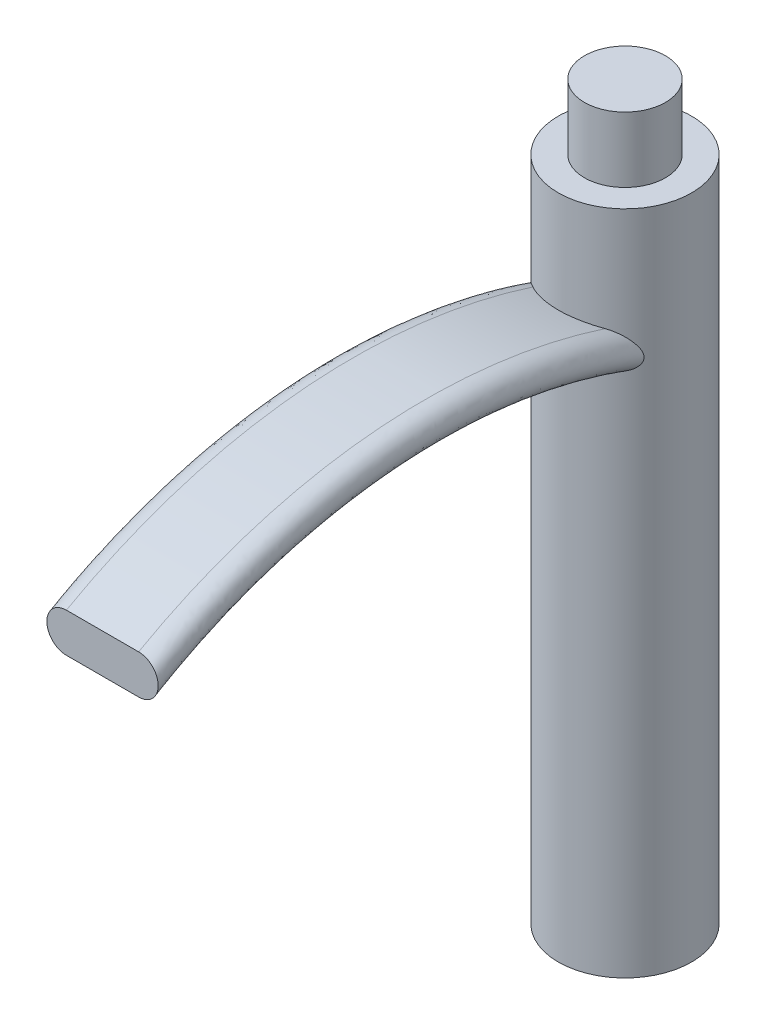
ISO-10303-21;
HEADER;
FILE_DESCRIPTION(('STEP AP214'),'2;1');
FILE_NAME('part.step','',(''),(''),'','','');
FILE_SCHEMA(('AUTOMOTIVE_DESIGN { 1 0 10303 214 1 1 1 1 }'));
ENDSEC;
DATA;
#1=APPLICATION_CONTEXT('core data for automotive mechanical design processes');
#2=APPLICATION_PROTOCOL_DEFINITION('international standard','automotive_design',2000,#1);
#3=PRODUCT_CONTEXT('',#1,'mechanical');
#4=PRODUCT('Part','Part','',(#3));
#5=PRODUCT_RELATED_PRODUCT_CATEGORY('part','',(#4));
#6=PRODUCT_DEFINITION_FORMATION('','',#4);
#7=PRODUCT_DEFINITION_CONTEXT('part definition',#1,'design');
#8=PRODUCT_DEFINITION('design','',#6,#7);
#9=PRODUCT_DEFINITION_SHAPE('','',#8);
#10=(LENGTH_UNIT() NAMED_UNIT(*) SI_UNIT(.MILLI.,.METRE.));
#11=(NAMED_UNIT(*) PLANE_ANGLE_UNIT() SI_UNIT($,.RADIAN.));
#12=(NAMED_UNIT(*) SI_UNIT($,.STERADIAN.) SOLID_ANGLE_UNIT());
#13=UNCERTAINTY_MEASURE_WITH_UNIT(LENGTH_MEASURE(1.E-05),#10,'distance_accuracy_value','');
#14=(GEOMETRIC_REPRESENTATION_CONTEXT(3) GLOBAL_UNCERTAINTY_ASSIGNED_CONTEXT((#13)) GLOBAL_UNIT_ASSIGNED_CONTEXT((#10,
#11,#12)) REPRESENTATION_CONTEXT('',''));
#15=CARTESIAN_POINT('',(0.,0.,0.));
#16=DIRECTION('',(0.,0.,1.));
#17=DIRECTION('',(1.,0.,0.));
#18=AXIS2_PLACEMENT_3D('',#15,#16,#17);
#19=CARTESIAN_POINT('',(0.,255.,0.));
#20=DIRECTION('',(0.,-1.,0.));
#21=DIRECTION('',(0.,0.,-1.));
#22=AXIS2_PLACEMENT_3D('',#19,#20,#21);
#23=CYLINDRICAL_SURFACE('',#22,25.5);
#24=CARTESIAN_POINT('',(0.,0.,0.));
#25=DIRECTION('',(0.,1.,0.));
#26=DIRECTION('',(0.,0.,1.));
#27=AXIS2_PLACEMENT_3D('',#24,#25,#26);
#28=CIRCLE('',#27,25.5);
#29=CARTESIAN_POINT('',(0.,0.,25.5));
#30=VERTEX_POINT('',#29);
#31=EDGE_CURVE('E115',#30,#30,#28,.T.);
#32=ORIENTED_EDGE('',*,*,#31,.T.);
#33=EDGE_LOOP('',(#32));
#34=FACE_BOUND('',#33,.T.);
#35=CARTESIAN_POINT('',(0.,255.,0.));
#36=DIRECTION('',(0.,1.,0.));
#37=DIRECTION('',(0.,0.,1.));
#38=AXIS2_PLACEMENT_3D('',#35,#36,#37);
#39=CIRCLE('',#38,25.5);
#40=CARTESIAN_POINT('',(0.,255.,25.5));
#41=VERTEX_POINT('',#40);
#42=EDGE_CURVE('E117',#41,#41,#39,.T.);
#43=ORIENTED_EDGE('',*,*,#42,.F.);
#44=EDGE_LOOP('',(#43));
#45=FACE_BOUND('',#44,.T.);
#46=CARTESIAN_POINT('',(13.8196887255631,214.884986685207,21.4304970434319));
#47=CARTESIAN_POINT('',(13.532798146598,214.945234375697,21.6155029437014));
#48=CARTESIAN_POINT('',(13.2419117728934,215.00339643538,21.7949250517388));
#49=CARTESIAN_POINT('',(12.6525624940685,215.115533242038,22.1422596832614));
#50=CARTESIAN_POINT('',(12.3540996431966,215.169508018984,22.3101722891239));
#51=CARTESIAN_POINT('',(11.4480530567104,215.325113080991,22.7960882597297));
#52=CARTESIAN_POINT('',(10.829725219313,215.420442128899,23.0963253235133));
#53=CARTESIAN_POINT('',(9.56895047867999,215.594067227174,23.646524715826));
#54=CARTESIAN_POINT('',(8.92650932711036,215.672367309504,23.896498944075));
#55=CARTESIAN_POINT('',(7.94820023785555,215.776975355202,24.2321082823706));
#56=CARTESIAN_POINT('',(7.61964826874133,215.809704961552,24.33742136081));
#57=CARTESIAN_POINT('',(6.95808921534775,215.870892028333,24.5347544640246));
#58=CARTESIAN_POINT('',(6.62508098736632,215.899348368202,24.6267710018604));
#59=CARTESIAN_POINT('',(5.61985324656249,215.978321264444,24.8826335475942));
#60=CARTESIAN_POINT('',(4.94183131288253,216.022398981806,25.0261549688713));
#61=CARTESIAN_POINT('',(3.57547465021561,216.093321797557,25.2575948826567));
#62=CARTESIAN_POINT('',(2.88713999184847,216.120167013896,25.345513755744));
#63=CARTESIAN_POINT('',(1.85085964276173,216.147499566447,25.4351062656168));
#64=CARTESIAN_POINT('',(1.50479458937133,216.154454550589,25.4579228433247));
#65=CARTESIAN_POINT('',(0.812053976632948,216.164054314837,25.4894246119201));
#66=CARTESIAN_POINT('',(0.465378597778197,216.166700206226,25.4981134462423));
#67=CARTESIAN_POINT('',(-0.574795102878685,216.168173129265,25.5029449402628));
#68=CARTESIAN_POINT('',(-1.26853278332441,216.160537823633,25.4778605192752));
#69=CARTESIAN_POINT('',(-2.64448121939722,216.12819106405,25.3718038099115));
#70=CARTESIAN_POINT('',(-3.32673860923,216.103645087736,25.291373115772));
#71=CARTESIAN_POINT('',(-4.68182856987711,216.037663617282,25.0759064586185));
#72=CARTESIAN_POINT('',(-5.35466044163665,215.996226877206,24.9408664673929));
#73=CARTESIAN_POINT('',(-6.68583695255088,215.896514926497,24.6174468865112));
#74=CARTESIAN_POINT('',(-7.34418624726443,215.838245214683,24.4290847159912));
#75=CARTESIAN_POINT('',(-8.64196304630876,215.704924169955,24.0006895031074));
#76=CARTESIAN_POINT('',(-9.28139629297756,215.629877990312,23.760672328582));
#77=CARTESIAN_POINT('',(-10.2507928710369,215.501129816785,23.3518497319931));
#78=CARTESIAN_POINT('',(-10.5889925548715,215.453286033916,23.2004371833328));
#79=CARTESIAN_POINT('',(-11.2579146358696,215.352673220706,22.8833196752015));
#80=CARTESIAN_POINT('',(-11.5886368164765,215.299904047947,22.7176143024624));
#81=CARTESIAN_POINT('',(-12.2412096635843,215.189589784856,22.3727218839855));
#82=CARTESIAN_POINT('',(-12.563078073561,215.132055340164,22.1935649685777));
#83=CARTESIAN_POINT('',(-13.1980800580386,215.012144836201,21.8219178949788));
#84=CARTESIAN_POINT('',(-13.5112139827944,214.949768971454,21.6294282725137));
#85=CARTESIAN_POINT('',(-13.8196887255631,214.884986685207,21.4304970434319));
#86=B_SPLINE_CURVE_WITH_KNOTS('',3,(#46,#47,#48,#49,#50,#51,#52,#53,#54,#55,#56,#57,#58,#59,#60,
#61,#62,#63,#64,#65,#66,#67,#68,#69,#70,#71,#72,#73,#74,#75,#76,#77,#78,#79,#80,#81,#82,#83,#84,
#85),.UNSPECIFIED.,.F.,.F.,(4,2,2,2,2,2,2,2,2,2,2,2,2,2,2,2,2,2,2,4),(0.,1.03979015362932,
2.07957286435021,4.15882724270732,6.2375887767455,7.27701727949552,8.31671787347411,
10.3973920597929,12.4780520045083,13.5184330677545,14.5585457822746,16.6384956144035,
18.6983761299918,20.758408618764,22.8177689171165,24.8764975037429,25.997042474922,
27.1176198568306,28.2357581050497,29.3538514510127),.UNSPECIFIED.);
#87=CARTESIAN_POINT('',(13.8196887255631,214.884986685207,21.4304970434319));
#88=VERTEX_POINT('',#87);
#89=CARTESIAN_POINT('',(-13.8196887255631,214.884986685207,21.4304970434319));
#90=VERTEX_POINT('',#89);
#91=EDGE_CURVE('E41',#88,#90,#86,.T.);
#92=ORIENTED_EDGE('',*,*,#91,.F.);
#93=CARTESIAN_POINT('',(13.8196887255631,201.258699076624,21.4304970434319));
#94=CARTESIAN_POINT('',(14.0221240799943,201.213283085582,21.2999703202598));
#95=CARTESIAN_POINT('',(14.223639095181,201.173891435771,21.1659450607403));
#96=CARTESIAN_POINT('',(14.6241745694017,201.106944234392,20.891202329935));
#97=CARTESIAN_POINT('',(14.8231940414344,201.079393230905,20.7504823101521));
#98=CARTESIAN_POINT('',(15.2179730865984,201.035944334901,20.4627228262207));
#99=CARTESIAN_POINT('',(15.4137319055702,201.020049102664,20.3156819275149));
#100=CARTESIAN_POINT('',(15.8031928976953,200.999747428518,20.0142525038005));
#101=CARTESIAN_POINT('',(15.9968563579354,200.995454616357,19.8598062784095));
#102=CARTESIAN_POINT('',(16.3795062967343,200.998730471166,19.5454109047559));
#103=CARTESIAN_POINT('',(16.5684935410221,201.006297182909,19.3854626678371));
#104=CARTESIAN_POINT('',(16.9411947859911,201.033498213782,19.0606137020647));
#105=CARTESIAN_POINT('',(17.124910300471,201.053129031612,18.895714423327));
#106=CARTESIAN_POINT('',(17.4379661363085,201.097932296693,18.6064445683791));
#107=CARTESIAN_POINT('',(17.5686606858122,201.120201206568,18.4830811303908));
#108=CARTESIAN_POINT('',(17.8267021382103,201.171682587077,18.234330142158));
#109=CARTESIAN_POINT('',(17.9540493447005,201.200894425574,18.1089427771553));
#110=CARTESIAN_POINT('',(18.2051822606488,201.266623158692,17.8564568412648));
#111=CARTESIAN_POINT('',(18.3289670901309,201.303141840825,17.729357858765));
#112=CARTESIAN_POINT('',(18.5722371433926,201.383813196673,17.4743511293789));
#113=CARTESIAN_POINT('',(18.6917358009064,201.427938930212,17.346447721544));
#114=CARTESIAN_POINT('',(18.9265291684782,201.524515830127,17.089959476287));
#115=CARTESIAN_POINT('',(19.041824657133,201.576965444848,16.9613747701754));
#116=CARTESIAN_POINT('',(19.2677710673765,201.690961139295,16.7042586777333));
#117=CARTESIAN_POINT('',(19.3784244918119,201.752502234114,16.575727300648));
#118=CARTESIAN_POINT('',(19.5716280480186,201.871549976837,16.3468283590451));
#119=CARTESIAN_POINT('',(19.6551516088303,201.927132844775,16.2462825337401));
#120=CARTESIAN_POINT('',(19.8186815574607,202.045178504284,16.0463868381469));
#121=CARTESIAN_POINT('',(19.8986884930179,202.107640219077,15.9470367833722));
#122=CARTESIAN_POINT('',(20.0547582441029,202.240152434094,15.7503147437327));
#123=CARTESIAN_POINT('',(20.130821931998,202.310201245135,15.6529423242786));
#124=CARTESIAN_POINT('',(20.2784238596274,202.458644782886,15.4612482410467));
#125=CARTESIAN_POINT('',(20.3499630436132,202.537037758969,15.3669259427385));
#126=CARTESIAN_POINT('',(20.526437041792,202.749579246138,15.1310065506297));
#127=CARTESIAN_POINT('',(20.6277056016291,202.890412623693,14.992431516466));
#128=CARTESIAN_POINT('',(20.7671271304323,203.120309505911,14.798070199788));
#129=CARTESIAN_POINT('',(20.8115031078479,203.200008428171,14.7355591009882));
#130=CARTESIAN_POINT('',(20.8955691433025,203.365825830209,14.6161039567273));
#131=CARTESIAN_POINT('',(20.9352605311075,203.451942476876,14.5591583322455));
#132=CARTESIAN_POINT('',(21.0016065863349,203.611824411553,14.463235693427));
#133=CARTESIAN_POINT('',(21.0292535176124,203.684418471265,14.4229884660175));
#134=CARTESIAN_POINT('',(21.0809341036313,203.83331873223,14.3473451870523));
#135=CARTESIAN_POINT('',(21.1049686155782,203.909624047119,14.3119479847914));
#136=CARTESIAN_POINT('',(21.149163285618,204.065535165599,14.2465592813946));
#137=CARTESIAN_POINT('',(21.1693262722203,204.145138507583,14.2165638347766));
#138=CARTESIAN_POINT('',(21.2056242770619,204.307189907277,14.1623643681338));
#139=CARTESIAN_POINT('',(21.2217592293226,204.38963801156,14.1381604429737));
#140=CARTESIAN_POINT('',(21.2499293266706,204.55680471041,14.095784927884));
#141=CARTESIAN_POINT('',(21.2619621308201,204.641524571738,14.0776167824917));
#142=CARTESIAN_POINT('',(21.2819436589884,204.812514155357,14.0473913090252));
#143=CARTESIAN_POINT('',(21.2898924261647,204.89878386126,14.0353339163767));
#144=CARTESIAN_POINT('',(21.3018386384569,205.072269137142,14.0171961819804));
#145=CARTESIAN_POINT('',(21.3058335136244,205.159485285112,14.0111197277337));
#146=CARTESIAN_POINT('',(21.3100722685453,205.334246975065,14.0046717900043));
#147=CARTESIAN_POINT('',(21.3103142435183,205.421792661759,14.0043032035437));
#148=CARTESIAN_POINT('',(21.3067374668789,205.629220846205,14.0097452211609));
#149=CARTESIAN_POINT('',(21.3013746917963,205.749018119707,14.0179054110233));
#150=CARTESIAN_POINT('',(21.2847839085726,205.987279085519,14.0430834464481));
#151=CARTESIAN_POINT('',(21.2735527418765,206.105742024537,14.0601060620319));
#152=CARTESIAN_POINT('',(21.2459039757601,206.340917322379,14.1018505536985));
#153=CARTESIAN_POINT('',(21.2294757680617,206.457625584539,14.1265881762952));
#154=CARTESIAN_POINT('',(21.1920763288265,206.688666129503,14.1826314825674));
#155=CARTESIAN_POINT('',(21.1711055561593,206.802998651016,14.2139365028236));
#156=CARTESIAN_POINT('',(21.1080687218431,207.113297528452,14.3075000264974));
#157=CARTESIAN_POINT('',(21.061914641777,207.306722804999,14.3754613224528));
#158=CARTESIAN_POINT('',(20.9596202389657,207.685859438576,14.5242031440754));
#159=CARTESIAN_POINT('',(20.9034721295338,207.871564640454,14.60499366009));
#160=CARTESIAN_POINT('',(20.7825778536763,208.235850853507,14.7765181601306));
#161=CARTESIAN_POINT('',(20.7178154502505,208.414417561743,14.867270863911));
#162=CARTESIAN_POINT('',(20.5807835398563,208.764509581776,15.0563940435648));
#163=CARTESIAN_POINT('',(20.5085120499837,208.936033016906,15.1547665298196));
#164=CARTESIAN_POINT('',(20.338209865005,209.314543770224,15.3828545996837));
#165=CARTESIAN_POINT('',(20.2382610901216,209.519653840707,15.5142495088326));
#166=CARTESIAN_POINT('',(20.0285453725472,209.920171102622,15.784061904798));
#167=CARTESIAN_POINT('',(19.9187720236752,210.115571831976,15.9224839478743));
#168=CARTESIAN_POINT('',(19.6899401945214,210.496991554952,16.2046061230043));
#169=CARTESIAN_POINT('',(19.5708788553491,210.683007630687,16.3483078729209));
#170=CARTESIAN_POINT('',(19.3235050598475,211.046206221951,16.6399764127183));
#171=CARTESIAN_POINT('',(19.1951713046843,211.223366709635,16.7879525210934));
#172=CARTESIAN_POINT('',(18.9296966529644,211.568311365357,17.0867348312203));
#173=CARTESIAN_POINT('',(18.7925590173014,211.736098962472,17.2375399706374));
#174=CARTESIAN_POINT('',(18.5095028918267,212.062152081856,17.5411342037132));
#175=CARTESIAN_POINT('',(18.3635849590846,212.220418206946,17.6939231710257));
#176=CARTESIAN_POINT('',(17.9756230680295,212.61616715289,18.0898367971506));
#177=CARTESIAN_POINT('',(17.7269551659346,212.846294502257,18.3339076272844));
#178=CARTESIAN_POINT('',(17.2073131655528,213.279715144141,18.8224766987254));
#179=CARTESIAN_POINT('',(16.9363301764795,213.482997656322,19.0669750720308));
#180=CARTESIAN_POINT('',(16.3735569689031,213.858154454239,19.5523390385582));
#181=CARTESIAN_POINT('',(16.0818889183939,214.030194760562,19.7932171972977));
#182=CARTESIAN_POINT('',(15.4769504897688,214.339488660163,20.26972897253));
#183=CARTESIAN_POINT('',(15.1637053439154,214.476782036589,20.5053683024969));
#184=CARTESIAN_POINT('',(14.6753761177563,214.653456771092,20.8548436082835));
#185=CARTESIAN_POINT('',(14.5078391594198,214.707843088031,20.971763027553));
#186=CARTESIAN_POINT('',(14.1675622854689,214.805219709158,21.2031270388132));
#187=CARTESIAN_POINT('',(13.9948172160936,214.848198282992,21.3175689730837));
#188=CARTESIAN_POINT('',(13.8196887255631,214.884986685207,21.430497043432));
#189=B_SPLINE_CURVE_WITH_KNOTS('',3,(#93,#94,#95,#96,#97,#98,#99,#100,#101,#102,#103,#104,#105,
#106,#107,#108,#109,#110,#111,#112,#113,#114,#115,#116,#117,#118,#119,#120,#121,#122,#123,#124,
#125,#126,#127,#128,#129,#130,#131,#132,#133,#134,#135,#136,#137,#138,#139,#140,#141,#142,#143,
#144,#145,#146,#147,#148,#149,#150,#151,#152,#153,#154,#155,#156,#157,#158,#159,#160,#161,#162,
#163,#164,#165,#166,#167,#168,#169,#170,#171,#172,#173,#174,#175,#176,#177,#178,#179,#180,#181,
#182,#183,#184,#185,#186,#187,#188),.UNSPECIFIED.,.F.,.F.,(4,2,2,2,2,2,2,2,2,2,2,2,2,2,2,2,2,2,
2,2,2,2,2,2,2,2,2,2,2,2,2,2,2,2,2,2,2,2,2,2,2,2,2,2,2,2,2,4),(0.,0.735216444351275,
1.47071503894104,2.20638144939533,2.94922702961238,3.69195015308185,4.43445782184243,
4.97758463661088,5.52066201994618,6.06387242204665,6.6051971603739,7.14642110860481,
7.68734939470969,8.11327822851045,8.53914048416909,8.96490812043674,9.3905866049576,
10.0540344383703,10.3854518640379,10.7167749862367,10.9789778463946,11.2411183888111,
11.5030666783198,11.7650192582285,12.027121075134,12.289220122264,12.5514894167253,
12.8138918213247,13.1739046852672,13.5341115194849,13.8950584097427,14.2559688557441,
14.8853537847605,15.515231252701,16.1463132551115,16.7775623312493,17.5669119300498,
18.3567800327394,19.1468922274835,19.9388808487146,20.7305777969277,21.5222245684433,
22.7734844227782,24.0252452392116,25.2701460563236,26.5136150220386,27.1475199842769,
27.7820742749393),.UNSPECIFIED.);
#190=CARTESIAN_POINT('',(13.8196887255631,201.258699076624,21.4304970434319));
#191=VERTEX_POINT('',#190);
#192=EDGE_CURVE('E105',#191,#88,#189,.T.);
#193=ORIENTED_EDGE('',*,*,#192,.F.);
#194=CARTESIAN_POINT('',(-13.8196887255631,201.258699076624,21.4304970434319));
#195=CARTESIAN_POINT('',(-13.5346906896665,201.322663367843,21.6142825946831));
#196=CARTESIAN_POINT('',(-13.2457067773122,201.384433576239,21.7925850563932));
#197=CARTESIAN_POINT('',(-12.6601727569227,201.503565881534,22.1378759650624));
#198=CARTESIAN_POINT('',(-12.3636226867645,201.560928000493,22.3048644686448));
#199=CARTESIAN_POINT('',(-11.4633082160255,201.726358350894,22.7882964860672));
#200=CARTESIAN_POINT('',(-10.8488024321114,201.827787846608,23.0872562866366));
#201=CARTESIAN_POINT('',(-9.59555841732733,202.012685718876,23.6356300697564));
#202=CARTESIAN_POINT('',(-8.95682380893578,202.096156768064,23.8850514243524));
#203=CARTESIAN_POINT('',(-7.98399535676274,202.207797575259,24.2203130212709));
#204=CARTESIAN_POINT('',(-7.65725787720661,202.242750798803,24.3255902553234));
#205=CARTESIAN_POINT('',(-6.99929733072024,202.308142577886,24.523006341156));
#206=CARTESIAN_POINT('',(-6.66807310861819,202.338579945686,24.6151417361856));
#207=CARTESIAN_POINT('',(-5.66809648959823,202.423134654366,24.8715974684266));
#208=CARTESIAN_POINT('',(-4.99348881568168,202.470443253266,25.015812617819));
#209=CARTESIAN_POINT('',(-3.63379900626822,202.546826341604,25.2491841974334));
#210=CARTESIAN_POINT('',(-2.94871695383099,202.575900975557,25.3383410640244));
#211=CARTESIAN_POINT('',(-1.91720437180168,202.605819712573,25.4301706885657));
#212=CARTESIAN_POINT('',(-1.57272004983487,202.613510419044,25.4537962729543));
#213=CARTESIAN_POINT('',(-0.883096190055104,202.624329346345,25.4870416333762));
#214=CARTESIAN_POINT('',(-0.537956844338869,202.627458744444,25.4966650233641));
#215=CARTESIAN_POINT('',(0.497676353803143,202.630003496925,25.5044845736528));
#216=CARTESIAN_POINT('',(1.18847749292039,202.622578073623,25.4816383084945));
#217=CARTESIAN_POINT('',(2.55782867903458,202.589668146822,25.3805799237253));
#218=CARTESIAN_POINT('',(3.2364298697395,202.56438338519,25.3029801861884));
#219=CARTESIAN_POINT('',(4.58442496389245,202.495990996439,25.0937878615659));
#220=CARTESIAN_POINT('',(5.2538182278141,202.45288213776,24.9621915435814));
#221=CARTESIAN_POINT('',(6.5784240563115,202.348899635379,24.6462557462592));
#222=CARTESIAN_POINT('',(7.23364003427314,202.288030320056,24.4619291179715));
#223=CARTESIAN_POINT('',(8.52543626354619,202.148600238021,24.0422100288537));
#224=CARTESIAN_POINT('',(9.16202189068152,202.070044632749,23.806832467091));
#225=CARTESIAN_POINT('',(10.1399302415448,201.933422310255,23.4003841799243));
#226=CARTESIAN_POINT('',(10.489113542724,201.881329972768,23.2459449409988));
#227=CARTESIAN_POINT('',(11.1795221440573,201.771567891416,22.92190347616));
#228=CARTESIAN_POINT('',(11.520747110735,201.713897914352,22.752300616283));
#229=CARTESIAN_POINT('',(12.1937454818667,201.593151353711,22.3988105750644));
#230=CARTESIAN_POINT('',(12.5255380213173,201.53008693887,22.2149556270416));
#231=CARTESIAN_POINT('',(13.1797792007235,201.398486851485,21.8331620002009));
#232=CARTESIAN_POINT('',(13.5022283620515,201.329951485031,21.6352241093674));
#233=CARTESIAN_POINT('',(13.8196887255631,201.258699076624,21.4304970434319));
#234=B_SPLINE_CURVE_WITH_KNOTS('',3,(#194,#195,#196,#197,#198,#199,#200,#201,#202,#203,#204,
#205,#206,#207,#208,#209,#210,#211,#212,#213,#214,#215,#216,#217,#218,#219,#220,#221,#222,#223,
#224,#225,#226,#227,#228,#229,#230,#231,#232,#233),.UNSPECIFIED.,.F.,.F.,(4,2,2,2,2,2,2,2,2,2,2,
2,2,2,2,2,2,2,2,4),(0.,1.03514818124239,2.07029118146819,4.14029785445722,6.20999624897043,
7.24488822764033,8.2800519180795,10.3518067286705,12.4235451191819,13.4594056076452,
14.4949986939287,16.5659081962837,18.6140157028599,20.6622647474555,22.7100150322561,
24.7571684893033,25.9128543234921,27.0685884974435,28.2217810609113,29.374909150342),.UNSPECIFIED.);
#235=CARTESIAN_POINT('',(-13.8196887255631,201.258699076624,21.4304970434319));
#236=VERTEX_POINT('',#235);
#237=EDGE_CURVE('E63',#236,#191,#234,.T.);
#238=ORIENTED_EDGE('',*,*,#237,.F.);
#239=CARTESIAN_POINT('',(-13.8196887255631,214.884986685207,21.4304970434319));
#240=CARTESIAN_POINT('',(-13.9964004171649,214.847867226434,21.3165516551254));
#241=CARTESIAN_POINT('',(-14.170710256153,214.804436309184,21.2010429233251));
#242=CARTESIAN_POINT('',(-14.5138899310028,214.705990945361,20.9675913041961));
#243=CARTESIAN_POINT('',(-14.6827688829359,214.650997218909,20.8496531068762));
#244=CARTESIAN_POINT('',(-15.0150004076458,214.530356115841,20.6116842948418));
#245=CARTESIAN_POINT('',(-15.1783556155489,214.464713908313,20.491654720452));
#246=CARTESIAN_POINT('',(-15.498754950375,214.323890950157,20.2503983464359));
#247=CARTESIAN_POINT('',(-15.6558229801669,214.248751988375,20.1291788171939));
#248=CARTESIAN_POINT('',(-15.9643353425821,214.089420196198,19.8853883759523));
#249=CARTESIAN_POINT('',(-16.1157770938909,214.005223277408,19.7628168763184));
#250=CARTESIAN_POINT('',(-16.4129380137241,213.828433538845,19.5167286079683));
#251=CARTESIAN_POINT('',(-16.558655772166,213.73583866863,19.3932116151774));
#252=CARTESIAN_POINT('',(-16.8936699685306,213.509489680262,19.1028422095727));
#253=CARTESIAN_POINT('',(-17.0806325465406,213.372566487801,18.9357586682619));
#254=CARTESIAN_POINT('',(-17.4441459869844,213.085710753979,18.6014184660721));
#255=CARTESIAN_POINT('',(-17.6206955062865,212.935776540525,18.4341617856795));
#256=CARTESIAN_POINT('',(-17.9634712612026,212.623761278284,18.1003024291463));
#257=CARTESIAN_POINT('',(-18.1296951087455,212.461677438576,17.933699912582));
#258=CARTESIAN_POINT('',(-18.4522547148855,212.12560108751,17.6016479464119));
#259=CARTESIAN_POINT('',(-18.6085630850809,211.951578138287,17.4362027257387));
#260=CARTESIAN_POINT('',(-18.9107777009569,211.592468577964,17.1079583870451));
#261=CARTESIAN_POINT('',(-19.0566863760704,211.407384569491,16.9451586579272));
#262=CARTESIAN_POINT('',(-19.3379971883418,211.026360742862,16.6234021394357));
#263=CARTESIAN_POINT('',(-19.4734033012198,210.830425081193,16.4644439117131));
#264=CARTESIAN_POINT('',(-19.7197682039259,210.448842479945,16.1682968273743));
#265=CARTESIAN_POINT('',(-19.8317984828558,210.264295391447,16.0305822537862));
#266=CARTESIAN_POINT('',(-20.0469423556346,209.88616683305,15.7607063196473));
#267=CARTESIAN_POINT('',(-20.1500569002475,209.692586329861,15.6285443677458));
#268=CARTESIAN_POINT('',(-20.3465777611294,209.296373775001,15.3718198436777));
#269=CARTESIAN_POINT('',(-20.440004728659,209.093762351485,15.2472413501206));
#270=CARTESIAN_POINT('',(-20.6164425440212,208.678516990106,15.0078100856533));
#271=CARTESIAN_POINT('',(-20.6994576880923,208.465887236269,14.8929533096668));
#272=CARTESIAN_POINT('',(-20.822629073984,208.117326388632,14.7198667823143));
#273=CARTESIAN_POINT('',(-20.8666191205385,207.984844830823,14.6574042094689));
#274=CARTESIAN_POINT('',(-20.9498245179231,207.715873017037,14.5382297353888));
#275=CARTESIAN_POINT('',(-20.9890410477055,207.579383761252,14.4815164147976));
#276=CARTESIAN_POINT('',(-21.0620660495322,207.302313540845,14.3751014031965));
#277=CARTESIAN_POINT('',(-21.0958768477779,207.161734367151,14.3253966973236));
#278=CARTESIAN_POINT('',(-21.1572621187927,206.876561617007,14.2345796240256));
#279=CARTESIAN_POINT('',(-21.1848388509475,206.731969516344,14.1934641440558));
#280=CARTESIAN_POINT('',(-21.242314786915,206.380144723302,14.1073655791091));
#281=CARTESIAN_POINT('',(-21.2687318686672,206.170987396731,14.0674122137805));
#282=CARTESIAN_POINT('',(-21.2948347474533,205.853812517247,14.0278380875112));
#283=CARTESIAN_POINT('',(-21.3012820608989,205.747566215751,14.0180391931628));
#284=CARTESIAN_POINT('',(-21.3091681068565,205.53443593584,14.0060493111222));
#285=CARTESIAN_POINT('',(-21.3106080034297,205.427552111415,14.003856555251));
#286=CARTESIAN_POINT('',(-21.308231120107,205.233498180645,14.0074724782623));
#287=CARTESIAN_POINT('',(-21.305325660472,205.146289952396,14.0118940276855));
#288=CARTESIAN_POINT('',(-21.2956207417531,204.97259718424,14.0266395580875));
#289=CARTESIAN_POINT('',(-21.2888221539253,204.886112486804,14.0369622184365));
#290=CARTESIAN_POINT('',(-21.2711834166175,204.714552153879,14.0636770240484));
#291=CARTESIAN_POINT('',(-21.2603457553774,204.629475684492,14.0800654325117));
#292=CARTESIAN_POINT('',(-21.2345699822987,204.461348156186,14.1189085993176));
#293=CARTESIAN_POINT('',(-21.2196318048462,204.378297129699,14.1413634547316));
#294=CARTESIAN_POINT('',(-21.185698839092,204.214840184548,14.192149087439));
#295=CARTESIAN_POINT('',(-21.1667029751652,204.134434973779,14.2204814226968));
#296=CARTESIAN_POINT('',(-21.1248074462791,203.976839282807,14.2826437791631));
#297=CARTESIAN_POINT('',(-21.1019078185178,203.899648771981,14.3164737479862));
#298=CARTESIAN_POINT('',(-21.0524181564429,203.748838841628,14.3891494222926));
#299=CARTESIAN_POINT('',(-21.0258256961771,203.675221812906,14.4279984237776));
#300=CARTESIAN_POINT('',(-20.9692323350079,203.531836939885,14.5101269640377));
#301=CARTESIAN_POINT('',(-20.9392297192277,203.462071058657,14.5534087308408));
#302=CARTESIAN_POINT('',(-20.8643360304268,203.30121674716,14.6606684858726));
#303=CARTESIAN_POINT('',(-20.8180688536346,203.211893987419,14.7263396875215));
#304=CARTESIAN_POINT('',(-20.7204414095028,203.040708910005,14.8633910501306));
#305=CARTESIAN_POINT('',(-20.6690784775654,202.958850538892,14.9347741940818));
#306=CARTESIAN_POINT('',(-20.5618511252582,202.80213518087,15.0820618167962));
#307=CARTESIAN_POINT('',(-20.5059779630991,202.727292429109,15.1579749977385));
#308=CARTESIAN_POINT('',(-20.3904091639275,202.584339287746,15.3130853703151));
#309=CARTESIAN_POINT('',(-20.330713987811,202.516228088897,15.3922821655745));
#310=CARTESIAN_POINT('',(-20.1666090787992,202.342396968619,15.6072565658397));
#311=CARTESIAN_POINT('',(-20.0591585469417,202.242237791775,15.7452222892664));
#312=CARTESIAN_POINT('',(-19.8364473591398,202.056941694023,16.024899358167));
#313=CARTESIAN_POINT('',(-19.7211814004611,201.971815116722,16.1666132061483));
#314=CARTESIAN_POINT('',(-19.4837371866903,201.814542907173,16.4520066106874));
#315=CARTESIAN_POINT('',(-19.3615444040011,201.742425991649,16.5956897803926));
#316=CARTESIAN_POINT('',(-19.1112978288199,201.60989197551,16.88326496024));
#317=CARTESIAN_POINT('',(-18.9832448014712,201.549473352864,17.0271569407568));
#318=CARTESIAN_POINT('',(-18.7449348993155,201.448901846418,17.2888105624208));
#319=CARTESIAN_POINT('',(-18.6355268510781,201.407054263205,17.4067010127443));
#320=CARTESIAN_POINT('',(-18.4133851240771,201.330000131458,17.6415246408024));
#321=CARTESIAN_POINT('',(-18.300651054341,201.294794367293,17.7584577039159));
#322=CARTESIAN_POINT('',(-17.9577026675739,201.198504437603,18.1073794380215));
#323=CARTESIAN_POINT('',(-17.7228090466717,201.146775208599,18.3374170806801));
#324=CARTESIAN_POINT('',(-17.2422468736312,201.066164737088,18.7899968408255));
#325=CARTESIAN_POINT('',(-16.9965779110316,201.037284365753,19.012538672205));
#326=CARTESIAN_POINT('',(-16.4958988042089,201.001263731464,19.4485326016829));
#327=CARTESIAN_POINT('',(-16.2408922286802,200.99411524889,19.6619881063615));
#328=CARTESIAN_POINT('',(-15.8073086545054,200.999970287804,20.0107289345275));
#329=CARTESIAN_POINT('',(-15.6308867156009,201.007169143074,20.1488328914484));
#330=CARTESIAN_POINT('',(-15.27490363497,201.031251085779,20.4200236713297));
#331=CARTESIAN_POINT('',(-15.0953429731827,201.048132704976,20.5531112516847));
#332=CARTESIAN_POINT('',(-14.7342740052233,201.091569118322,20.813468881333));
#333=CARTESIAN_POINT('',(-14.5527760376671,201.118085896108,20.9407596114106));
#334=CARTESIAN_POINT('',(-14.1876687843101,201.180966308266,21.1898329726331));
#335=CARTESIAN_POINT('',(-14.0040591080068,201.217331792859,21.3116145637847));
#336=CARTESIAN_POINT('',(-13.8196887255631,201.258699076624,21.4304970434319));
#337=B_SPLINE_CURVE_WITH_KNOTS('',3,(#239,#240,#241,#242,#243,#244,#245,#246,#247,#248,#249,
#250,#251,#252,#253,#254,#255,#256,#257,#258,#259,#260,#261,#262,#263,#264,#265,#266,#267,#268,
#269,#270,#271,#272,#273,#274,#275,#276,#277,#278,#279,#280,#281,#282,#283,#284,#285,#286,#287,
#288,#289,#290,#291,#292,#293,#294,#295,#296,#297,#298,#299,#300,#301,#302,#303,#304,#305,#306,
#307,#308,#309,#310,#311,#312,#313,#314,#315,#316,#317,#318,#319,#320,#321,#322,#323,#324,#325,
#326,#327,#328,#329,#330,#331,#332,#333,#334,#335,#336),.UNSPECIFIED.,.F.,.F.,(4,2,2,2,2,2,2,2,
2,2,2,2,2,2,2,2,2,2,2,2,2,2,2,2,2,2,2,2,2,2,2,2,2,2,2,2,2,2,2,2,2,2,2,2,2,2,2,2,4),(0.,
0.640349108882811,1.27956036933961,1.91846226112059,2.55464474639941,3.19111559311829,
3.82774226093619,4.68427804859558,5.54092407627431,6.39776749287934,7.2568829495546,
8.1157970492764,8.97438440596057,9.74226653708585,10.5100666808677,11.2761948974182,
12.0420059385246,12.5006074577005,12.9590954817021,13.4173856744117,13.8755095037446,
14.5168557909045,14.8372216217121,15.1575129729232,15.4193555962469,15.6811396438359,
15.9427626872547,16.2043899172441,16.4660865865144,16.7277807622958,16.989647674753,
17.2516468606618,17.6114784472014,17.9714991933835,18.3322353109438,18.6929280090258,
19.2965127642187,19.9005112284147,20.5058270293826,21.1110640214626,21.6094610605535,
22.1079169213003,23.1051371223723,24.1023953432663,25.0992763257167,25.7715070735837,
26.4436359151873,27.113141109045,27.7827721664705),.UNSPECIFIED.);
#338=EDGE_CURVE('E58',#90,#236,#337,.T.);
#339=ORIENTED_EDGE('',*,*,#338,.F.);
#340=EDGE_LOOP('',(#92,#193,#238,#339));
#341=FACE_BOUND('',#340,.T.);
#342=ADVANCED_FACE('F37',(#34,#45,#341),#23,.T.);
#343=CARTESIAN_POINT('',(0.,255.,0.));
#344=DIRECTION('',(0.,1.,0.));
#345=DIRECTION('',(0.,0.,1.));
#346=AXIS2_PLACEMENT_3D('',#343,#344,#345);
#347=PLANE('',#346);
#348=CARTESIAN_POINT('',(0.,255.,0.));
#349=DIRECTION('',(0.,1.,0.));
#350=DIRECTION('',(0.,0.,1.));
#351=AXIS2_PLACEMENT_3D('',#348,#349,#350);
#352=CIRCLE('',#351,15.5);
#353=CARTESIAN_POINT('',(0.,255.,15.5));
#354=VERTEX_POINT('',#353);
#355=EDGE_CURVE('E11',#354,#354,#352,.T.);
#356=ORIENTED_EDGE('',*,*,#355,.F.);
#357=EDGE_LOOP('',(#356));
#358=FACE_BOUND('',#357,.T.);
#359=ORIENTED_EDGE('',*,*,#42,.T.);
#360=EDGE_LOOP('',(#359));
#361=FACE_BOUND('',#360,.T.);
#362=ADVANCED_FACE('F149',(#358,#361),#347,.T.);
#363=CARTESIAN_POINT('',(0.,0.,0.));
#364=DIRECTION('',(0.,1.,0.));
#365=DIRECTION('',(0.,0.,1.));
#366=AXIS2_PLACEMENT_3D('',#363,#364,#365);
#367=PLANE('',#366);
#368=ORIENTED_EDGE('',*,*,#31,.F.);
#369=EDGE_LOOP('',(#368));
#370=FACE_BOUND('',#369,.T.);
#371=ADVANCED_FACE('F151',(#370),#367,.F.);
#372=CARTESIAN_POINT('',(0.,3.02359979920792,90.4241799899604));
#373=DIRECTION('',(-1.,0.,0.));
#374=DIRECTION('',(0.,0.,1.));
#375=AXIS2_PLACEMENT_3D('',#372,#373,#374);
#376=CYLINDRICAL_SURFACE('',#375,222.81242231928);
#377=CARTESIAN_POINT('',(13.8196887255631,3.02359979920792,90.4241799899604));
#378=DIRECTION('',(-1.,0.,0.));
#379=DIRECTION('',(0.,0.87071663406133,0.491785057895122));
#380=AXIS2_PLACEMENT_3D('',#377,#378,#379);
#381=CIRCLE('',#380,222.81242231928);
#382=CARTESIAN_POINT('',(13.8196887255631,197.030082188103,200.));
#383=VERTEX_POINT('',#382);
#384=EDGE_CURVE('E87',#383,#88,#381,.T.);
#385=ORIENTED_EDGE('',*,*,#384,.T.);
#386=ORIENTED_EDGE('',*,*,#91,.T.);
#387=CARTESIAN_POINT('',(-13.8196887255631,3.02359979920792,90.4241799899604));
#388=DIRECTION('',(-1.,0.,0.));
#389=DIRECTION('',(0.,0.87071663406133,0.491785057895122));
#390=AXIS2_PLACEMENT_3D('',#387,#388,#389);
#391=CIRCLE('',#390,222.81242231928);
#392=CARTESIAN_POINT('',(-13.8196887255631,197.030082188103,200.));
#393=VERTEX_POINT('',#392);
#394=EDGE_CURVE('E89',#393,#90,#391,.T.);
#395=ORIENTED_EDGE('',*,*,#394,.F.);
#396=DIRECTION('',(-1.,0.,0.));
#397=VECTOR('',#396,1.);
#398=CARTESIAN_POINT('',(-13.8196887255631,197.030082188103,200.));
#399=LINE('',#398,#397);
#400=EDGE_CURVE('E83',#383,#393,#399,.T.);
#401=ORIENTED_EDGE('',*,*,#400,.F.);
#402=EDGE_LOOP('',(#385,#386,#395,#401));
#403=FACE_BOUND('',#402,.T.);
#404=ADVANCED_FACE('F85',(#403),#376,.T.);
#405=CARTESIAN_POINT('',(-13.8196887255631,197.030082188103,200.));
#406=CARTESIAN_POINT('',(-13.8196887255631,233.611144665295,135.232396594448));
#407=CARTESIAN_POINT('',(-13.8196887255631,236.060150891098,60.8884731617613));
#408=CARTESIAN_POINT('',(-13.8196887255631,203.820862900327,-6.14618125449784));
#409=CARTESIAN_POINT('',(-28.7998531017693,197.030082188103,200.));
#410=CARTESIAN_POINT('',(-28.7998531017693,233.611144665295,135.232396594448));
#411=CARTESIAN_POINT('',(-28.7998531017693,236.060150891098,60.8884731617613));
#412=CARTESIAN_POINT('',(-28.7998531017693,203.820862900327,-6.14618125449784));
#413=CARTESIAN_POINT('',(-28.7998531017693,182.049917811897,200.));
#414=CARTESIAN_POINT('',(-28.7998531017693,218.630980289089,140.233411680754));
#415=CARTESIAN_POINT('',(-28.7998531017693,223.394712420142,70.3225679763184));
#416=CARTESIAN_POINT('',(-28.7998531017693,195.259137099673,6.14618125449798));
#417=CARTESIAN_POINT('',(-13.8196887255631,182.049917811897,200.));
#418=CARTESIAN_POINT('',(-13.8196887255631,218.630980289089,140.233411680754));
#419=CARTESIAN_POINT('',(-13.8196887255631,223.394712420142,70.3225679763184));
#420=CARTESIAN_POINT('',(-13.8196887255631,195.259137099673,6.14618125449798));
#421=(BOUNDED_SURFACE() B_SPLINE_SURFACE(3,3,((#405,#406,#407,#408),(#409,#410,#411,#412),(#413,
#414,#415,#416),(#417,#418,#419,#420)),.UNSPECIFIED.,.F.,.F.,
.F.) B_SPLINE_SURFACE_WITH_KNOTS((4,4),(4,4),(0.,1.),(0.,1.),
.UNSPECIFIED.) GEOMETRIC_REPRESENTATION_ITEM() RATIONAL_B_SPLINE_SURFACE(((1.,0.924290655896264,
0.924290655896264,1.),(0.333333333333333,0.308096885298755,0.308096885298755,0.333333333333333),
(0.333333333333333,0.308096885298755,0.308096885298755,0.333333333333333),(1.,0.924290655896264,
0.924290655896264,1.))) REPRESENTATION_ITEM('') SURFACE());
#422=CARTESIAN_POINT('',(-13.8196887255631,3.02359979920792,90.4241799899604));
#423=DIRECTION('',(-1.,0.,0.));
#424=DIRECTION('',(0.,0.852919463292418,0.522042516598958));
#425=AXIS2_PLACEMENT_3D('',#422,#423,#424);
#426=CIRCLE('',#425,209.898267911036);
#427=CARTESIAN_POINT('',(-13.8196887255631,182.049917811897,200.));
#428=VERTEX_POINT('',#427);
#429=EDGE_CURVE('E107',#428,#236,#426,.T.);
#430=CARTESIAN_POINT('',(-13.8196887255631,189.54,200.));
#431=DIRECTION('',(0.,0.,1.));
#432=DIRECTION('',(1.,0.,0.));
#433=AXIS2_PLACEMENT_3D('',#430,#431,#432);
#434=CIRCLE('',#433,7.4900821881031);
#435=EDGE_CURVE('E92',#393,#428,#434,.T.);
#436=ORIENTED_EDGE('',*,*,#394,.T.);
#437=ORIENTED_EDGE('',*,*,#338,.T.);
#438=ORIENTED_EDGE('',*,*,#429,.F.);
#439=ORIENTED_EDGE('',*,*,#435,.F.);
#440=EDGE_LOOP('',(#436,#437,#438,#439));
#441=FACE_BOUND('',#440,.T.);
#442=ADVANCED_FACE('F158',(#441),#421,.F.);
#443=CARTESIAN_POINT('',(0.,3.02359979920792,90.4241799899604));
#444=DIRECTION('',(-1.,0.,0.));
#445=DIRECTION('',(0.,0.,1.));
#446=AXIS2_PLACEMENT_3D('',#443,#444,#445);
#447=CYLINDRICAL_SURFACE('',#446,209.898267911036);
#448=ORIENTED_EDGE('',*,*,#429,.T.);
#449=ORIENTED_EDGE('',*,*,#237,.T.);
#450=CARTESIAN_POINT('',(13.8196887255631,3.02359979920792,90.4241799899604));
#451=DIRECTION('',(-1.,0.,0.));
#452=DIRECTION('',(0.,0.852919463292418,0.522042516598958));
#453=AXIS2_PLACEMENT_3D('',#450,#451,#452);
#454=CIRCLE('',#453,209.898267911036);
#455=CARTESIAN_POINT('',(13.8196887255631,182.049917811897,200.));
#456=VERTEX_POINT('',#455);
#457=EDGE_CURVE('E113',#456,#191,#454,.T.);
#458=ORIENTED_EDGE('',*,*,#457,.F.);
#459=DIRECTION('',(1.,0.,0.));
#460=VECTOR('',#459,1.);
#461=CARTESIAN_POINT('',(-13.8196887255631,182.049917811897,200.));
#462=LINE('',#461,#460);
#463=EDGE_CURVE('E98',#428,#456,#462,.T.);
#464=ORIENTED_EDGE('',*,*,#463,.F.);
#465=EDGE_LOOP('',(#448,#449,#458,#464));
#466=FACE_BOUND('',#465,.T.);
#467=ADVANCED_FACE('F138',(#466),#447,.F.);
#468=CARTESIAN_POINT('',(13.8196887255631,182.049917811897,200.));
#469=CARTESIAN_POINT('',(13.8196887255631,218.630980289089,140.233411680754));
#470=CARTESIAN_POINT('',(13.8196887255631,223.394712420142,70.3225679763184));
#471=CARTESIAN_POINT('',(13.8196887255631,195.259137099673,6.14618125449798));
#472=CARTESIAN_POINT('',(28.7998531017693,182.049917811897,200.));
#473=CARTESIAN_POINT('',(28.7998531017693,218.630980289089,140.233411680754));
#474=CARTESIAN_POINT('',(28.7998531017693,223.394712420142,70.3225679763184));
#475=CARTESIAN_POINT('',(28.7998531017693,195.259137099673,6.14618125449798));
#476=CARTESIAN_POINT('',(28.7998531017693,197.030082188103,200.));
#477=CARTESIAN_POINT('',(28.7998531017693,233.611144665295,135.232396594448));
#478=CARTESIAN_POINT('',(28.7998531017693,236.060150891098,60.8884731617613));
#479=CARTESIAN_POINT('',(28.7998531017693,203.820862900327,-6.14618125449784));
#480=CARTESIAN_POINT('',(13.8196887255631,197.030082188103,200.));
#481=CARTESIAN_POINT('',(13.8196887255631,233.611144665295,135.232396594448));
#482=CARTESIAN_POINT('',(13.8196887255631,236.060150891098,60.8884731617613));
#483=CARTESIAN_POINT('',(13.8196887255631,203.820862900327,-6.14618125449784));
#484=(BOUNDED_SURFACE() B_SPLINE_SURFACE(3,3,((#468,#469,#470,#471),(#472,#473,#474,#475),(#476,
#477,#478,#479),(#480,#481,#482,#483)),.UNSPECIFIED.,.F.,.F.,
.F.) B_SPLINE_SURFACE_WITH_KNOTS((4,4),(4,4),(0.,1.),(0.,1.),
.UNSPECIFIED.) GEOMETRIC_REPRESENTATION_ITEM() RATIONAL_B_SPLINE_SURFACE(((1.,0.924290655896264,
0.924290655896264,1.),(0.333333333333333,0.308096885298755,0.308096885298755,0.333333333333333),
(0.333333333333333,0.308096885298755,0.308096885298755,0.333333333333333),(1.,0.924290655896264,
0.924290655896264,1.))) REPRESENTATION_ITEM('') SURFACE());
#485=CARTESIAN_POINT('',(13.8196887255631,189.54,200.));
#486=DIRECTION('',(0.,0.,1.));
#487=DIRECTION('',(1.,0.,0.));
#488=AXIS2_PLACEMENT_3D('',#485,#486,#487);
#489=CIRCLE('',#488,7.4900821881031);
#490=EDGE_CURVE('E96',#456,#383,#489,.T.);
#491=ORIENTED_EDGE('',*,*,#457,.T.);
#492=ORIENTED_EDGE('',*,*,#192,.T.);
#493=ORIENTED_EDGE('',*,*,#384,.F.);
#494=ORIENTED_EDGE('',*,*,#490,.F.);
#495=EDGE_LOOP('',(#491,#492,#493,#494));
#496=FACE_BOUND('',#495,.T.);
#497=ADVANCED_FACE('F104',(#496),#484,.F.);
#498=CARTESIAN_POINT('',(-13.8196887255631,189.54,200.));
#499=DIRECTION('',(0.,0.,1.));
#500=DIRECTION('',(1.,0.,0.));
#501=AXIS2_PLACEMENT_3D('',#498,#499,#500);
#502=PLANE('',#501);
#503=ORIENTED_EDGE('',*,*,#435,.T.);
#504=ORIENTED_EDGE('',*,*,#463,.T.);
#505=ORIENTED_EDGE('',*,*,#490,.T.);
#506=ORIENTED_EDGE('',*,*,#400,.T.);
#507=EDGE_LOOP('',(#503,#504,#505,#506));
#508=FACE_BOUND('',#507,.T.);
#509=ADVANCED_FACE('F97',(#508),#502,.T.);
#510=CARTESIAN_POINT('',(0.,280.,0.));
#511=DIRECTION('',(0.,-1.,0.));
#512=DIRECTION('',(0.,0.,-1.));
#513=AXIS2_PLACEMENT_3D('',#510,#511,#512);
#514=CYLINDRICAL_SURFACE('',#513,15.5);
#515=CARTESIAN_POINT('',(0.,280.,0.));
#516=DIRECTION('',(0.,1.,0.));
#517=DIRECTION('',(0.,0.,1.));
#518=AXIS2_PLACEMENT_3D('',#515,#516,#517);
#519=CIRCLE('',#518,15.5);
#520=CARTESIAN_POINT('',(0.,280.,15.5));
#521=VERTEX_POINT('',#520);
#522=EDGE_CURVE('E93',#521,#521,#519,.T.);
#523=ORIENTED_EDGE('',*,*,#522,.F.);
#524=EDGE_LOOP('',(#523));
#525=FACE_BOUND('',#524,.T.);
#526=ORIENTED_EDGE('',*,*,#355,.T.);
#527=EDGE_LOOP('',(#526));
#528=FACE_BOUND('',#527,.T.);
#529=ADVANCED_FACE('F148',(#525,#528),#514,.T.);
#530=CARTESIAN_POINT('',(0.,280.,0.));
#531=DIRECTION('',(0.,1.,0.));
#532=DIRECTION('',(0.,0.,1.));
#533=AXIS2_PLACEMENT_3D('',#530,#531,#532);
#534=PLANE('',#533);
#535=ORIENTED_EDGE('',*,*,#522,.T.);
#536=EDGE_LOOP('',(#535));
#537=FACE_BOUND('',#536,.T.);
#538=ADVANCED_FACE('F185',(#537),#534,.T.);
#539=CLOSED_SHELL('',(#342,#362,#371,#404,#442,#467,#497,#509,#529,#538));
#540=MANIFOLD_SOLID_BREP('B2',#539);
#541=ADVANCED_BREP_SHAPE_REPRESENTATION('',(#18,#540),#14);
#542=SHAPE_DEFINITION_REPRESENTATION(#9,#541);
ENDSEC;
END-ISO-10303-21;
